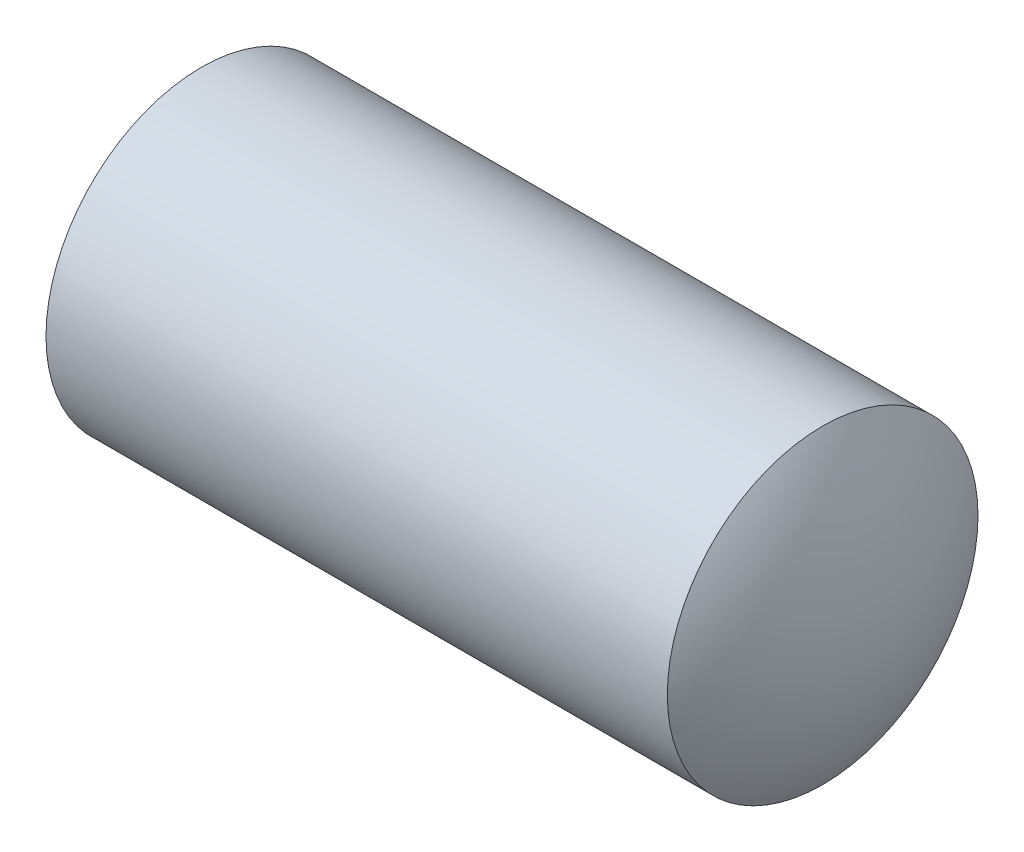
ISO-10303-21;
HEADER;
FILE_DESCRIPTION(('STEP AP214'),'2;1');
FILE_NAME('part.step','',(''),(''),'','','');
FILE_SCHEMA(('AUTOMOTIVE_DESIGN { 1 0 10303 214 1 1 1 1 }'));
ENDSEC;
DATA;
#1=APPLICATION_CONTEXT('core data for automotive mechanical design processes');
#2=APPLICATION_PROTOCOL_DEFINITION('international standard','automotive_design',2000,#1);
#3=PRODUCT_CONTEXT('',#1,'mechanical');
#4=PRODUCT('Part','Part','',(#3));
#5=PRODUCT_RELATED_PRODUCT_CATEGORY('part','',(#4));
#6=PRODUCT_DEFINITION_FORMATION('','',#4);
#7=PRODUCT_DEFINITION_CONTEXT('part definition',#1,'design');
#8=PRODUCT_DEFINITION('design','',#6,#7);
#9=PRODUCT_DEFINITION_SHAPE('','',#8);
#10=(LENGTH_UNIT() NAMED_UNIT(*) SI_UNIT(.MILLI.,.METRE.));
#11=(NAMED_UNIT(*) PLANE_ANGLE_UNIT() SI_UNIT($,.RADIAN.));
#12=(NAMED_UNIT(*) SI_UNIT($,.STERADIAN.) SOLID_ANGLE_UNIT());
#13=UNCERTAINTY_MEASURE_WITH_UNIT(LENGTH_MEASURE(1.E-05),#10,'distance_accuracy_value','');
#14=(GEOMETRIC_REPRESENTATION_CONTEXT(3) GLOBAL_UNCERTAINTY_ASSIGNED_CONTEXT((#13)) GLOBAL_UNIT_ASSIGNED_CONTEXT((#10,
#11,#12)) REPRESENTATION_CONTEXT('',''));
#15=CARTESIAN_POINT('',(0.,0.,0.));
#16=DIRECTION('',(0.,0.,1.));
#17=DIRECTION('',(1.,0.,0.));
#18=AXIS2_PLACEMENT_3D('',#15,#16,#17);
#19=CARTESIAN_POINT('',(1.81666666666667,0.,0.));
#20=DIRECTION('',(-1.,0.,0.));
#21=DIRECTION('',(0.,1.,0.));
#22=AXIS2_PLACEMENT_3D('',#19,#20,#21);
#23=SPHERICAL_SURFACE('',#22,1.81666666666667);
#24=CARTESIAN_POINT('',(0.3,0.,0.));
#25=DIRECTION('',(-1.,0.,0.));
#26=DIRECTION('',(0.,0.,1.));
#27=AXIS2_PLACEMENT_3D('',#24,#25,#26);
#28=CIRCLE('',#27,1.);
#29=CARTESIAN_POINT('',(0.3,0.,1.));
#30=VERTEX_POINT('',#29);
#31=EDGE_CURVE('E10',#30,#30,#28,.T.);
#32=ORIENTED_EDGE('',*,*,#31,.T.);
#33=EDGE_LOOP('',(#32));
#34=FACE_BOUND('',#33,.T.);
#35=ADVANCED_FACE('F39',(#34),#23,.T.);
#36=CARTESIAN_POINT('',(0.3,0.,0.));
#37=DIRECTION('',(-1.,0.,0.));
#38=DIRECTION('',(0.,0.,1.));
#39=AXIS2_PLACEMENT_3D('',#36,#37,#38);
#40=CYLINDRICAL_SURFACE('',#39,1.);
#41=ORIENTED_EDGE('',*,*,#31,.F.);
#42=EDGE_LOOP('',(#41));
#43=FACE_BOUND('',#42,.T.);
#44=CARTESIAN_POINT('',(4.3,0.,0.));
#45=DIRECTION('',(-1.,0.,0.));
#46=DIRECTION('',(0.,0.,1.));
#47=AXIS2_PLACEMENT_3D('',#44,#45,#46);
#48=CIRCLE('',#47,1.);
#49=CARTESIAN_POINT('',(4.3,0.,1.));
#50=VERTEX_POINT('',#49);
#51=EDGE_CURVE('E45',#50,#50,#48,.T.);
#52=ORIENTED_EDGE('',*,*,#51,.T.);
#53=EDGE_LOOP('',(#52));
#54=FACE_BOUND('',#53,.T.);
#55=ADVANCED_FACE('F51',(#43,#54),#40,.T.);
#56=CARTESIAN_POINT('',(2.78333333333333,0.,0.));
#57=DIRECTION('',(-1.,0.,0.));
#58=DIRECTION('',(0.,1.,0.));
#59=AXIS2_PLACEMENT_3D('',#56,#57,#58);
#60=SPHERICAL_SURFACE('',#59,1.81666666666667);
#61=ORIENTED_EDGE('',*,*,#51,.F.);
#62=EDGE_LOOP('',(#61));
#63=FACE_BOUND('',#62,.T.);
#64=ADVANCED_FACE('F53',(#63),#60,.T.);
#65=CLOSED_SHELL('',(#35,#55,#64));
#66=MANIFOLD_SOLID_BREP('B2',#65);
#67=ADVANCED_BREP_SHAPE_REPRESENTATION('',(#18,#66),#14);
#68=SHAPE_DEFINITION_REPRESENTATION(#9,#67);
ENDSEC;
END-ISO-10303-21;
